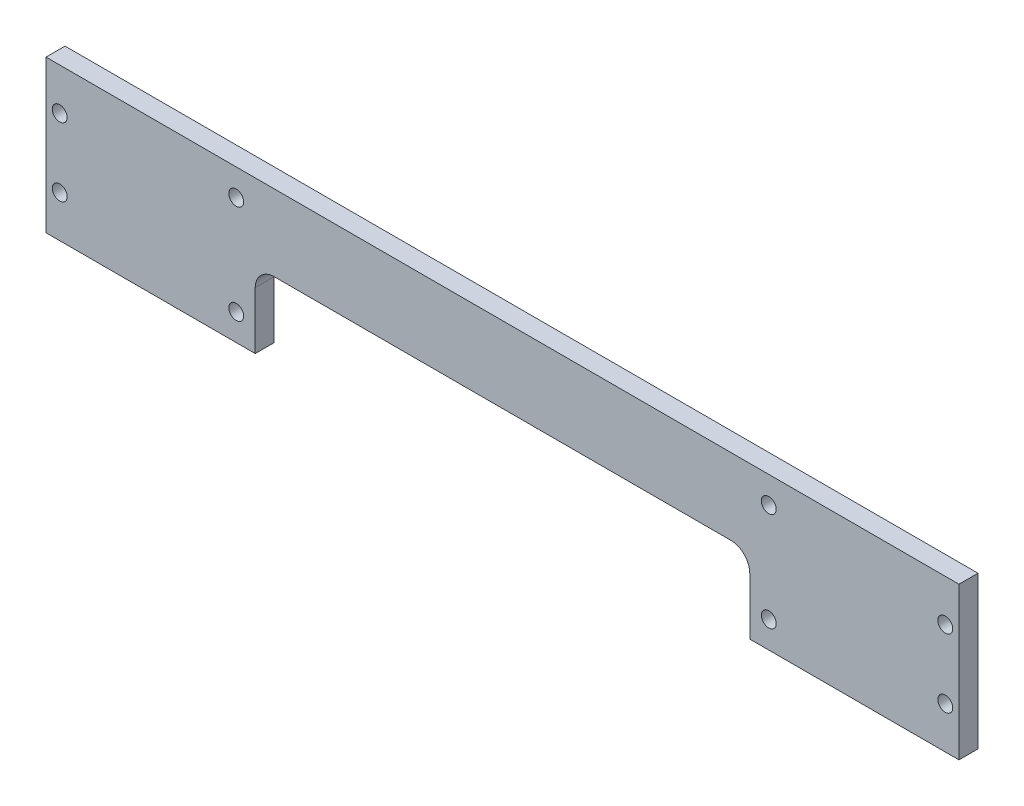
ISO-10303-21;
HEADER;
FILE_DESCRIPTION(('STEP AP214'),'2;1');
FILE_NAME('part.step','',(''),(''),'','','');
FILE_SCHEMA(('AUTOMOTIVE_DESIGN { 1 0 10303 214 1 1 1 1 }'));
ENDSEC;
DATA;
#1=APPLICATION_CONTEXT('core data for automotive mechanical design processes');
#2=APPLICATION_PROTOCOL_DEFINITION('international standard','automotive_design',2000,#1);
#3=PRODUCT_CONTEXT('',#1,'mechanical');
#4=PRODUCT('Part','Part','',(#3));
#5=PRODUCT_RELATED_PRODUCT_CATEGORY('part','',(#4));
#6=PRODUCT_DEFINITION_FORMATION('','',#4);
#7=PRODUCT_DEFINITION_CONTEXT('part definition',#1,'design');
#8=PRODUCT_DEFINITION('design','',#6,#7);
#9=PRODUCT_DEFINITION_SHAPE('','',#8);
#10=(LENGTH_UNIT() NAMED_UNIT(*) SI_UNIT(.MILLI.,.METRE.));
#11=(NAMED_UNIT(*) PLANE_ANGLE_UNIT() SI_UNIT($,.RADIAN.));
#12=(NAMED_UNIT(*) SI_UNIT($,.STERADIAN.) SOLID_ANGLE_UNIT());
#13=UNCERTAINTY_MEASURE_WITH_UNIT(LENGTH_MEASURE(1.E-05),#10,'distance_accuracy_value','');
#14=(GEOMETRIC_REPRESENTATION_CONTEXT(3) GLOBAL_UNCERTAINTY_ASSIGNED_CONTEXT((#13)) GLOBAL_UNIT_ASSIGNED_CONTEXT((#10,
#11,#12)) REPRESENTATION_CONTEXT('',''));
#15=CARTESIAN_POINT('',(0.,0.,0.));
#16=DIRECTION('',(0.,0.,1.));
#17=DIRECTION('',(1.,0.,0.));
#18=AXIS2_PLACEMENT_3D('',#15,#16,#17);
#19=CARTESIAN_POINT('',(-152.4,-25.4,6.35));
#20=DIRECTION('',(0.,1.,0.));
#21=DIRECTION('',(0.,0.,1.));
#22=AXIS2_PLACEMENT_3D('',#19,#20,#21);
#23=PLANE('',#22);
#24=DIRECTION('',(1.,0.,0.));
#25=VECTOR('',#24,1.);
#26=CARTESIAN_POINT('',(-152.4,-25.4,0.));
#27=LINE('',#26,#25);
#28=CARTESIAN_POINT('',(-152.4,-25.4,0.));
#29=VERTEX_POINT('',#28);
#30=CARTESIAN_POINT('',(-82.55,-25.4,0.));
#31=VERTEX_POINT('',#30);
#32=EDGE_CURVE('E125',#29,#31,#27,.T.);
#33=ORIENTED_EDGE('',*,*,#32,.T.);
#34=DIRECTION('',(0.,0.,1.));
#35=VECTOR('',#34,1.);
#36=CARTESIAN_POINT('',(-82.55,-25.4,0.));
#37=LINE('',#36,#35);
#38=CARTESIAN_POINT('',(-82.55,-25.4,6.35));
#39=VERTEX_POINT('',#38);
#40=EDGE_CURVE('E132',#31,#39,#37,.T.);
#41=ORIENTED_EDGE('',*,*,#40,.T.);
#42=DIRECTION('',(1.,0.,0.));
#43=VECTOR('',#42,1.);
#44=CARTESIAN_POINT('',(-152.4,-25.4,6.35));
#45=LINE('',#44,#43);
#46=CARTESIAN_POINT('',(-152.4,-25.4,6.35));
#47=VERTEX_POINT('',#46);
#48=EDGE_CURVE('E163',#47,#39,#45,.T.);
#49=ORIENTED_EDGE('',*,*,#48,.F.);
#50=DIRECTION('',(0.,0.,-1.));
#51=VECTOR('',#50,1.);
#52=CARTESIAN_POINT('',(-152.4,-25.4,6.35));
#53=LINE('',#52,#51);
#54=EDGE_CURVE('E145',#47,#29,#53,.T.);
#55=ORIENTED_EDGE('',*,*,#54,.T.);
#56=EDGE_LOOP('',(#33,#41,#49,#55));
#57=FACE_BOUND('',#56,.T.);
#58=ADVANCED_FACE('F43',(#57),#23,.F.);
#59=CARTESIAN_POINT('',(0.,0.,6.35));
#60=DIRECTION('',(0.,0.,1.));
#61=DIRECTION('',(1.,0.,0.));
#62=AXIS2_PLACEMENT_3D('',#59,#60,#61);
#63=PLANE('',#62);
#64=DIRECTION('',(0.,-1.,0.));
#65=VECTOR('',#64,1.);
#66=CARTESIAN_POINT('',(-82.55,-25.4,6.35));
#67=LINE('',#66,#65);
#68=CARTESIAN_POINT('',(-82.55,-6.35,6.35));
#69=VERTEX_POINT('',#68);
#70=EDGE_CURVE('E135',#69,#39,#67,.T.);
#71=ORIENTED_EDGE('',*,*,#70,.F.);
#72=CARTESIAN_POINT('',(-76.2,-6.35,6.35));
#73=DIRECTION('',(0.,0.,1.));
#74=DIRECTION('',(1.,0.,0.));
#75=AXIS2_PLACEMENT_3D('',#72,#73,#74);
#76=CIRCLE('',#75,6.35);
#77=CARTESIAN_POINT('',(-76.2,0.,6.35));
#78=VERTEX_POINT('',#77);
#79=EDGE_CURVE('E52',#69,#78,#76,.F.);
#80=ORIENTED_EDGE('',*,*,#79,.T.);
#81=DIRECTION('',(-1.,0.,0.));
#82=VECTOR('',#81,1.);
#83=CARTESIAN_POINT('',(-82.55,0.,6.35));
#84=LINE('',#83,#82);
#85=CARTESIAN_POINT('',(76.2,0.,6.35));
#86=VERTEX_POINT('',#85);
#87=EDGE_CURVE('E129',#86,#78,#84,.T.);
#88=ORIENTED_EDGE('',*,*,#87,.F.);
#89=CARTESIAN_POINT('',(76.2,-6.35,6.35));
#90=DIRECTION('',(0.,0.,1.));
#91=DIRECTION('',(1.,0.,0.));
#92=AXIS2_PLACEMENT_3D('',#89,#90,#91);
#93=CIRCLE('',#92,6.35);
#94=CARTESIAN_POINT('',(82.55,-6.35,6.35));
#95=VERTEX_POINT('',#94);
#96=EDGE_CURVE('E187',#86,#95,#93,.F.);
#97=ORIENTED_EDGE('',*,*,#96,.T.);
#98=DIRECTION('',(0.,1.,0.));
#99=VECTOR('',#98,1.);
#100=CARTESIAN_POINT('',(82.55,-25.4,6.35));
#101=LINE('',#100,#99);
#102=CARTESIAN_POINT('',(82.55,-25.4,6.35));
#103=VERTEX_POINT('',#102);
#104=EDGE_CURVE('E203',#103,#95,#101,.T.);
#105=ORIENTED_EDGE('',*,*,#104,.F.);
#106=CARTESIAN_POINT('',(152.4,-25.4,6.35));
#107=VERTEX_POINT('',#106);
#108=EDGE_CURVE('E237',#103,#107,#45,.T.);
#109=ORIENTED_EDGE('',*,*,#108,.T.);
#110=DIRECTION('',(0.,1.,0.));
#111=VECTOR('',#110,1.);
#112=CARTESIAN_POINT('',(152.4,25.4,6.35));
#113=LINE('',#112,#111);
#114=CARTESIAN_POINT('',(152.4,25.4,6.35));
#115=VERTEX_POINT('',#114);
#116=EDGE_CURVE('E147',#107,#115,#113,.T.);
#117=ORIENTED_EDGE('',*,*,#116,.T.);
#118=DIRECTION('',(-1.,0.,0.));
#119=VECTOR('',#118,1.);
#120=CARTESIAN_POINT('',(-152.4,25.4,6.35));
#121=LINE('',#120,#119);
#122=CARTESIAN_POINT('',(-152.4,25.4,6.35));
#123=VERTEX_POINT('',#122);
#124=EDGE_CURVE('E153',#115,#123,#121,.T.);
#125=ORIENTED_EDGE('',*,*,#124,.T.);
#126=DIRECTION('',(0.,-1.,0.));
#127=VECTOR('',#126,1.);
#128=CARTESIAN_POINT('',(-152.4,25.4,6.35));
#129=LINE('',#128,#127);
#130=EDGE_CURVE('E242',#123,#47,#129,.T.);
#131=ORIENTED_EDGE('',*,*,#130,.T.);
#132=ORIENTED_EDGE('',*,*,#48,.T.);
#133=EDGE_LOOP('',(#71,#80,#88,#97,#105,#109,#117,#125,#131,#132));
#134=FACE_BOUND('',#133,.T.);
#135=CARTESIAN_POINT('',(147.828,11.43,6.35));
#136=DIRECTION('',(0.,0.,1.));
#137=DIRECTION('',(1.,0.,0.));
#138=AXIS2_PLACEMENT_3D('',#135,#136,#137);
#139=CIRCLE('',#138,2.4892);
#140=CARTESIAN_POINT('',(150.3172,11.43,6.35));
#141=VERTEX_POINT('',#140);
#142=EDGE_CURVE('E309',#141,#141,#139,.T.);
#143=ORIENTED_EDGE('',*,*,#142,.F.);
#144=EDGE_LOOP('',(#143));
#145=FACE_BOUND('',#144,.T.);
#146=CARTESIAN_POINT('',(-147.828,11.43,6.35));
#147=DIRECTION('',(0.,0.,1.));
#148=DIRECTION('',(1.,0.,0.));
#149=AXIS2_PLACEMENT_3D('',#146,#147,#148);
#150=CIRCLE('',#149,2.4892);
#151=CARTESIAN_POINT('',(-145.3388,11.43,6.35));
#152=VERTEX_POINT('',#151);
#153=EDGE_CURVE('E293',#152,#152,#150,.T.);
#154=ORIENTED_EDGE('',*,*,#153,.F.);
#155=EDGE_LOOP('',(#154));
#156=FACE_BOUND('',#155,.T.);
#157=CARTESIAN_POINT('',(88.9,-16.51,6.35));
#158=DIRECTION('',(0.,0.,1.));
#159=DIRECTION('',(1.,0.,0.));
#160=AXIS2_PLACEMENT_3D('',#157,#158,#159);
#161=CIRCLE('',#160,2.4892);
#162=CARTESIAN_POINT('',(91.3892,-16.51,6.35));
#163=VERTEX_POINT('',#162);
#164=EDGE_CURVE('E277',#163,#163,#161,.T.);
#165=ORIENTED_EDGE('',*,*,#164,.F.);
#166=EDGE_LOOP('',(#165));
#167=FACE_BOUND('',#166,.T.);
#168=CARTESIAN_POINT('',(-88.9,16.51,6.35));
#169=DIRECTION('',(0.,0.,1.));
#170=DIRECTION('',(1.,0.,0.));
#171=AXIS2_PLACEMENT_3D('',#168,#169,#170);
#172=CIRCLE('',#171,2.4892);
#173=CARTESIAN_POINT('',(-86.4108,16.51,6.35));
#174=VERTEX_POINT('',#173);
#175=EDGE_CURVE('E253',#174,#174,#172,.T.);
#176=ORIENTED_EDGE('',*,*,#175,.F.);
#177=EDGE_LOOP('',(#176));
#178=FACE_BOUND('',#177,.T.);
#179=CARTESIAN_POINT('',(-88.9,-16.51,6.35));
#180=DIRECTION('',(0.,0.,1.));
#181=DIRECTION('',(1.,0.,0.));
#182=AXIS2_PLACEMENT_3D('',#179,#180,#181);
#183=CIRCLE('',#182,2.4892);
#184=CARTESIAN_POINT('',(-86.4108,-16.51,6.35));
#185=VERTEX_POINT('',#184);
#186=EDGE_CURVE('E269',#185,#185,#183,.T.);
#187=ORIENTED_EDGE('',*,*,#186,.F.);
#188=EDGE_LOOP('',(#187));
#189=FACE_BOUND('',#188,.T.);
#190=CARTESIAN_POINT('',(88.9,16.51,6.35));
#191=DIRECTION('',(0.,0.,1.));
#192=DIRECTION('',(1.,0.,0.));
#193=AXIS2_PLACEMENT_3D('',#190,#191,#192);
#194=CIRCLE('',#193,2.4892);
#195=CARTESIAN_POINT('',(91.3892,16.51,6.35));
#196=VERTEX_POINT('',#195);
#197=EDGE_CURVE('E285',#196,#196,#194,.T.);
#198=ORIENTED_EDGE('',*,*,#197,.F.);
#199=EDGE_LOOP('',(#198));
#200=FACE_BOUND('',#199,.T.);
#201=CARTESIAN_POINT('',(-147.828,-11.43,6.35));
#202=DIRECTION('',(0.,0.,1.));
#203=DIRECTION('',(1.,0.,0.));
#204=AXIS2_PLACEMENT_3D('',#201,#202,#203);
#205=CIRCLE('',#204,2.4892);
#206=CARTESIAN_POINT('',(-145.3388,-11.43,6.35));
#207=VERTEX_POINT('',#206);
#208=EDGE_CURVE('E301',#207,#207,#205,.T.);
#209=ORIENTED_EDGE('',*,*,#208,.F.);
#210=EDGE_LOOP('',(#209));
#211=FACE_BOUND('',#210,.T.);
#212=CARTESIAN_POINT('',(147.828,-11.43,6.35));
#213=DIRECTION('',(0.,0.,1.));
#214=DIRECTION('',(1.,0.,0.));
#215=AXIS2_PLACEMENT_3D('',#212,#213,#214);
#216=CIRCLE('',#215,2.4892);
#217=CARTESIAN_POINT('',(150.3172,-11.43,6.35));
#218=VERTEX_POINT('',#217);
#219=EDGE_CURVE('E317',#218,#218,#216,.T.);
#220=ORIENTED_EDGE('',*,*,#219,.F.);
#221=EDGE_LOOP('',(#220));
#222=FACE_BOUND('',#221,.T.);
#223=ADVANCED_FACE('F196',(#134,#145,#156,#167,#178,#189,#200,#211,#222),#63,.T.);
#224=CARTESIAN_POINT('',(0.,0.,0.));
#225=DIRECTION('',(0.,0.,1.));
#226=DIRECTION('',(1.,0.,0.));
#227=AXIS2_PLACEMENT_3D('',#224,#225,#226);
#228=PLANE('',#227);
#229=DIRECTION('',(0.,1.,0.));
#230=VECTOR('',#229,1.);
#231=CARTESIAN_POINT('',(82.55,-25.4,0.));
#232=LINE('',#231,#230);
#233=CARTESIAN_POINT('',(82.55,-25.4,0.));
#234=VERTEX_POINT('',#233);
#235=CARTESIAN_POINT('',(82.55,-6.35,0.));
#236=VERTEX_POINT('',#235);
#237=EDGE_CURVE('E128',#234,#236,#232,.T.);
#238=ORIENTED_EDGE('',*,*,#237,.T.);
#239=CARTESIAN_POINT('',(76.2,-6.35,0.));
#240=DIRECTION('',(0.,0.,1.));
#241=DIRECTION('',(1.,0.,0.));
#242=AXIS2_PLACEMENT_3D('',#239,#240,#241);
#243=CIRCLE('',#242,6.35);
#244=CARTESIAN_POINT('',(76.2,0.,0.));
#245=VERTEX_POINT('',#244);
#246=EDGE_CURVE('E190',#236,#245,#243,.T.);
#247=ORIENTED_EDGE('',*,*,#246,.T.);
#248=DIRECTION('',(-1.,0.,0.));
#249=VECTOR('',#248,1.);
#250=CARTESIAN_POINT('',(-82.55,0.,0.));
#251=LINE('',#250,#249);
#252=CARTESIAN_POINT('',(-76.2,0.,0.));
#253=VERTEX_POINT('',#252);
#254=EDGE_CURVE('E141',#245,#253,#251,.T.);
#255=ORIENTED_EDGE('',*,*,#254,.T.);
#256=CARTESIAN_POINT('',(-76.2,-6.35,0.));
#257=DIRECTION('',(0.,0.,1.));
#258=DIRECTION('',(1.,0.,0.));
#259=AXIS2_PLACEMENT_3D('',#256,#257,#258);
#260=CIRCLE('',#259,6.35);
#261=CARTESIAN_POINT('',(-82.55,-6.35,0.));
#262=VERTEX_POINT('',#261);
#263=EDGE_CURVE('E11',#253,#262,#260,.T.);
#264=ORIENTED_EDGE('',*,*,#263,.T.);
#265=DIRECTION('',(0.,-1.,0.));
#266=VECTOR('',#265,1.);
#267=CARTESIAN_POINT('',(-82.55,-25.4,0.));
#268=LINE('',#267,#266);
#269=EDGE_CURVE('E118',#262,#31,#268,.T.);
#270=ORIENTED_EDGE('',*,*,#269,.T.);
#271=ORIENTED_EDGE('',*,*,#32,.F.);
#272=DIRECTION('',(0.,-1.,0.));
#273=VECTOR('',#272,1.);
#274=CARTESIAN_POINT('',(-152.4,25.4,0.));
#275=LINE('',#274,#273);
#276=CARTESIAN_POINT('',(-152.4,25.4,0.));
#277=VERTEX_POINT('',#276);
#278=EDGE_CURVE('E155',#277,#29,#275,.T.);
#279=ORIENTED_EDGE('',*,*,#278,.F.);
#280=DIRECTION('',(-1.,0.,0.));
#281=VECTOR('',#280,1.);
#282=CARTESIAN_POINT('',(-152.4,25.4,0.));
#283=LINE('',#282,#281);
#284=CARTESIAN_POINT('',(152.4,25.4,0.));
#285=VERTEX_POINT('',#284);
#286=EDGE_CURVE('E252',#285,#277,#283,.T.);
#287=ORIENTED_EDGE('',*,*,#286,.F.);
#288=DIRECTION('',(0.,1.,0.));
#289=VECTOR('',#288,1.);
#290=CARTESIAN_POINT('',(152.4,25.4,0.));
#291=LINE('',#290,#289);
#292=CARTESIAN_POINT('',(152.4,-25.4,0.));
#293=VERTEX_POINT('',#292);
#294=EDGE_CURVE('E249',#293,#285,#291,.T.);
#295=ORIENTED_EDGE('',*,*,#294,.F.);
#296=EDGE_CURVE('E148',#234,#293,#27,.T.);
#297=ORIENTED_EDGE('',*,*,#296,.F.);
#298=EDGE_LOOP('',(#238,#247,#255,#264,#270,#271,#279,#287,#295,#297));
#299=FACE_BOUND('',#298,.T.);
#300=CARTESIAN_POINT('',(-88.9,16.51,0.));
#301=DIRECTION('',(0.,0.,1.));
#302=DIRECTION('',(1.,0.,0.));
#303=AXIS2_PLACEMENT_3D('',#300,#301,#302);
#304=CIRCLE('',#303,2.4892);
#305=CARTESIAN_POINT('',(-86.4108,16.51,0.));
#306=VERTEX_POINT('',#305);
#307=EDGE_CURVE('E265',#306,#306,#304,.T.);
#308=ORIENTED_EDGE('',*,*,#307,.T.);
#309=EDGE_LOOP('',(#308));
#310=FACE_BOUND('',#309,.T.);
#311=CARTESIAN_POINT('',(-88.9,-16.51,0.));
#312=DIRECTION('',(0.,0.,1.));
#313=DIRECTION('',(1.,0.,0.));
#314=AXIS2_PLACEMENT_3D('',#311,#312,#313);
#315=CIRCLE('',#314,2.4892);
#316=CARTESIAN_POINT('',(-86.4108,-16.51,0.));
#317=VERTEX_POINT('',#316);
#318=EDGE_CURVE('E273',#317,#317,#315,.T.);
#319=ORIENTED_EDGE('',*,*,#318,.T.);
#320=EDGE_LOOP('',(#319));
#321=FACE_BOUND('',#320,.T.);
#322=CARTESIAN_POINT('',(88.9,-16.51,0.));
#323=DIRECTION('',(0.,0.,1.));
#324=DIRECTION('',(1.,0.,0.));
#325=AXIS2_PLACEMENT_3D('',#322,#323,#324);
#326=CIRCLE('',#325,2.4892);
#327=CARTESIAN_POINT('',(91.3892,-16.51,0.));
#328=VERTEX_POINT('',#327);
#329=EDGE_CURVE('E281',#328,#328,#326,.T.);
#330=ORIENTED_EDGE('',*,*,#329,.T.);
#331=EDGE_LOOP('',(#330));
#332=FACE_BOUND('',#331,.T.);
#333=CARTESIAN_POINT('',(88.9,16.51,0.));
#334=DIRECTION('',(0.,0.,1.));
#335=DIRECTION('',(1.,0.,0.));
#336=AXIS2_PLACEMENT_3D('',#333,#334,#335);
#337=CIRCLE('',#336,2.4892);
#338=CARTESIAN_POINT('',(91.3892,16.51,0.));
#339=VERTEX_POINT('',#338);
#340=EDGE_CURVE('E289',#339,#339,#337,.T.);
#341=ORIENTED_EDGE('',*,*,#340,.T.);
#342=EDGE_LOOP('',(#341));
#343=FACE_BOUND('',#342,.T.);
#344=CARTESIAN_POINT('',(-147.828,11.43,0.));
#345=DIRECTION('',(0.,0.,1.));
#346=DIRECTION('',(1.,0.,0.));
#347=AXIS2_PLACEMENT_3D('',#344,#345,#346);
#348=CIRCLE('',#347,2.4892);
#349=CARTESIAN_POINT('',(-145.3388,11.43,0.));
#350=VERTEX_POINT('',#349);
#351=EDGE_CURVE('E297',#350,#350,#348,.T.);
#352=ORIENTED_EDGE('',*,*,#351,.T.);
#353=EDGE_LOOP('',(#352));
#354=FACE_BOUND('',#353,.T.);
#355=CARTESIAN_POINT('',(-147.828,-11.43,0.));
#356=DIRECTION('',(0.,0.,1.));
#357=DIRECTION('',(1.,0.,0.));
#358=AXIS2_PLACEMENT_3D('',#355,#356,#357);
#359=CIRCLE('',#358,2.4892);
#360=CARTESIAN_POINT('',(-145.3388,-11.43,0.));
#361=VERTEX_POINT('',#360);
#362=EDGE_CURVE('E305',#361,#361,#359,.T.);
#363=ORIENTED_EDGE('',*,*,#362,.T.);
#364=EDGE_LOOP('',(#363));
#365=FACE_BOUND('',#364,.T.);
#366=CARTESIAN_POINT('',(147.828,11.43,0.));
#367=DIRECTION('',(0.,0.,1.));
#368=DIRECTION('',(1.,0.,0.));
#369=AXIS2_PLACEMENT_3D('',#366,#367,#368);
#370=CIRCLE('',#369,2.4892);
#371=CARTESIAN_POINT('',(150.3172,11.43,0.));
#372=VERTEX_POINT('',#371);
#373=EDGE_CURVE('E313',#372,#372,#370,.T.);
#374=ORIENTED_EDGE('',*,*,#373,.T.);
#375=EDGE_LOOP('',(#374));
#376=FACE_BOUND('',#375,.T.);
#377=CARTESIAN_POINT('',(147.828,-11.43,0.));
#378=DIRECTION('',(0.,0.,1.));
#379=DIRECTION('',(1.,0.,0.));
#380=AXIS2_PLACEMENT_3D('',#377,#378,#379);
#381=CIRCLE('',#380,2.4892);
#382=CARTESIAN_POINT('',(150.3172,-11.43,0.));
#383=VERTEX_POINT('',#382);
#384=EDGE_CURVE('E321',#383,#383,#381,.T.);
#385=ORIENTED_EDGE('',*,*,#384,.T.);
#386=EDGE_LOOP('',(#385));
#387=FACE_BOUND('',#386,.T.);
#388=ADVANCED_FACE('F121',(#299,#310,#321,#332,#343,#354,#365,#376,#387),#228,.F.);
#389=CARTESIAN_POINT('',(152.4,25.4,6.35));
#390=DIRECTION('',(-1.,0.,0.));
#391=DIRECTION('',(0.,0.,1.));
#392=AXIS2_PLACEMENT_3D('',#389,#390,#391);
#393=PLANE('',#392);
#394=ORIENTED_EDGE('',*,*,#294,.T.);
#395=DIRECTION('',(0.,0.,-1.));
#396=VECTOR('',#395,1.);
#397=CARTESIAN_POINT('',(152.4,25.4,6.35));
#398=LINE('',#397,#396);
#399=EDGE_CURVE('E170',#115,#285,#398,.T.);
#400=ORIENTED_EDGE('',*,*,#399,.F.);
#401=ORIENTED_EDGE('',*,*,#116,.F.);
#402=DIRECTION('',(0.,0.,-1.));
#403=VECTOR('',#402,1.);
#404=CARTESIAN_POINT('',(152.4,-25.4,6.35));
#405=LINE('',#404,#403);
#406=EDGE_CURVE('E159',#107,#293,#405,.T.);
#407=ORIENTED_EDGE('',*,*,#406,.T.);
#408=EDGE_LOOP('',(#394,#400,#401,#407));
#409=FACE_BOUND('',#408,.T.);
#410=ADVANCED_FACE('F262',(#409),#393,.F.);
#411=CARTESIAN_POINT('',(-152.4,25.4,6.35));
#412=DIRECTION('',(0.,-1.,0.));
#413=DIRECTION('',(0.,0.,-1.));
#414=AXIS2_PLACEMENT_3D('',#411,#412,#413);
#415=PLANE('',#414);
#416=ORIENTED_EDGE('',*,*,#286,.T.);
#417=DIRECTION('',(0.,0.,-1.));
#418=VECTOR('',#417,1.);
#419=CARTESIAN_POINT('',(-152.4,25.4,6.35));
#420=LINE('',#419,#418);
#421=EDGE_CURVE('E166',#123,#277,#420,.T.);
#422=ORIENTED_EDGE('',*,*,#421,.F.);
#423=ORIENTED_EDGE('',*,*,#124,.F.);
#424=ORIENTED_EDGE('',*,*,#399,.T.);
#425=EDGE_LOOP('',(#416,#422,#423,#424));
#426=FACE_BOUND('',#425,.T.);
#427=ADVANCED_FACE('F232',(#426),#415,.F.);
#428=CARTESIAN_POINT('',(-152.4,25.4,6.35));
#429=DIRECTION('',(1.,0.,0.));
#430=DIRECTION('',(0.,0.,-1.));
#431=AXIS2_PLACEMENT_3D('',#428,#429,#430);
#432=PLANE('',#431);
#433=ORIENTED_EDGE('',*,*,#278,.T.);
#434=ORIENTED_EDGE('',*,*,#54,.F.);
#435=ORIENTED_EDGE('',*,*,#130,.F.);
#436=ORIENTED_EDGE('',*,*,#421,.T.);
#437=EDGE_LOOP('',(#433,#434,#435,#436));
#438=FACE_BOUND('',#437,.T.);
#439=ADVANCED_FACE('F223',(#438),#432,.F.);
#440=ORIENTED_EDGE('',*,*,#108,.F.);
#441=DIRECTION('',(0.,0.,1.));
#442=VECTOR('',#441,1.);
#443=CARTESIAN_POINT('',(82.55,-25.4,0.));
#444=LINE('',#443,#442);
#445=EDGE_CURVE('E140',#234,#103,#444,.T.);
#446=ORIENTED_EDGE('',*,*,#445,.F.);
#447=ORIENTED_EDGE('',*,*,#296,.T.);
#448=ORIENTED_EDGE('',*,*,#406,.F.);
#449=EDGE_LOOP('',(#440,#446,#447,#448));
#450=FACE_BOUND('',#449,.T.);
#451=ADVANCED_FACE('F214',(#450),#23,.F.);
#452=CARTESIAN_POINT('',(-88.9,16.51,6.35));
#453=DIRECTION('',(0.,0.,-1.));
#454=DIRECTION('',(-1.,0.,0.));
#455=AXIS2_PLACEMENT_3D('',#452,#453,#454);
#456=CYLINDRICAL_SURFACE('',#455,2.4892);
#457=ORIENTED_EDGE('',*,*,#175,.T.);
#458=EDGE_LOOP('',(#457));
#459=FACE_BOUND('',#458,.T.);
#460=ORIENTED_EDGE('',*,*,#307,.F.);
#461=EDGE_LOOP('',(#460));
#462=FACE_BOUND('',#461,.T.);
#463=ADVANCED_FACE('F222',(#459,#462),#456,.F.);
#464=CARTESIAN_POINT('',(-88.9,-16.51,6.35));
#465=DIRECTION('',(0.,0.,-1.));
#466=DIRECTION('',(-1.,0.,0.));
#467=AXIS2_PLACEMENT_3D('',#464,#465,#466);
#468=CYLINDRICAL_SURFACE('',#467,2.4892);
#469=ORIENTED_EDGE('',*,*,#186,.T.);
#470=EDGE_LOOP('',(#469));
#471=FACE_BOUND('',#470,.T.);
#472=ORIENTED_EDGE('',*,*,#318,.F.);
#473=EDGE_LOOP('',(#472));
#474=FACE_BOUND('',#473,.T.);
#475=ADVANCED_FACE('F229',(#471,#474),#468,.F.);
#476=CARTESIAN_POINT('',(88.9,-16.51,6.35));
#477=DIRECTION('',(0.,0.,-1.));
#478=DIRECTION('',(-1.,0.,0.));
#479=AXIS2_PLACEMENT_3D('',#476,#477,#478);
#480=CYLINDRICAL_SURFACE('',#479,2.4892);
#481=ORIENTED_EDGE('',*,*,#164,.T.);
#482=EDGE_LOOP('',(#481));
#483=FACE_BOUND('',#482,.T.);
#484=ORIENTED_EDGE('',*,*,#329,.F.);
#485=EDGE_LOOP('',(#484));
#486=FACE_BOUND('',#485,.T.);
#487=ADVANCED_FACE('F369',(#483,#486),#480,.F.);
#488=CARTESIAN_POINT('',(88.9,16.51,6.35));
#489=DIRECTION('',(0.,0.,-1.));
#490=DIRECTION('',(-1.,0.,0.));
#491=AXIS2_PLACEMENT_3D('',#488,#489,#490);
#492=CYLINDRICAL_SURFACE('',#491,2.4892);
#493=ORIENTED_EDGE('',*,*,#197,.T.);
#494=EDGE_LOOP('',(#493));
#495=FACE_BOUND('',#494,.T.);
#496=ORIENTED_EDGE('',*,*,#340,.F.);
#497=EDGE_LOOP('',(#496));
#498=FACE_BOUND('',#497,.T.);
#499=ADVANCED_FACE('F365',(#495,#498),#492,.F.);
#500=CARTESIAN_POINT('',(-147.828,11.43,6.35));
#501=DIRECTION('',(0.,0.,-1.));
#502=DIRECTION('',(-1.,0.,0.));
#503=AXIS2_PLACEMENT_3D('',#500,#501,#502);
#504=CYLINDRICAL_SURFACE('',#503,2.4892);
#505=ORIENTED_EDGE('',*,*,#153,.T.);
#506=EDGE_LOOP('',(#505));
#507=FACE_BOUND('',#506,.T.);
#508=ORIENTED_EDGE('',*,*,#351,.F.);
#509=EDGE_LOOP('',(#508));
#510=FACE_BOUND('',#509,.T.);
#511=ADVANCED_FACE('F361',(#507,#510),#504,.F.);
#512=CARTESIAN_POINT('',(-147.828,-11.43,6.35));
#513=DIRECTION('',(0.,0.,-1.));
#514=DIRECTION('',(-1.,0.,0.));
#515=AXIS2_PLACEMENT_3D('',#512,#513,#514);
#516=CYLINDRICAL_SURFACE('',#515,2.4892);
#517=ORIENTED_EDGE('',*,*,#208,.T.);
#518=EDGE_LOOP('',(#517));
#519=FACE_BOUND('',#518,.T.);
#520=ORIENTED_EDGE('',*,*,#362,.F.);
#521=EDGE_LOOP('',(#520));
#522=FACE_BOUND('',#521,.T.);
#523=ADVANCED_FACE('F357',(#519,#522),#516,.F.);
#524=CARTESIAN_POINT('',(147.828,11.43,6.35));
#525=DIRECTION('',(0.,0.,-1.));
#526=DIRECTION('',(-1.,0.,0.));
#527=AXIS2_PLACEMENT_3D('',#524,#525,#526);
#528=CYLINDRICAL_SURFACE('',#527,2.4892);
#529=ORIENTED_EDGE('',*,*,#142,.T.);
#530=EDGE_LOOP('',(#529));
#531=FACE_BOUND('',#530,.T.);
#532=ORIENTED_EDGE('',*,*,#373,.F.);
#533=EDGE_LOOP('',(#532));
#534=FACE_BOUND('',#533,.T.);
#535=ADVANCED_FACE('F353',(#531,#534),#528,.F.);
#536=CARTESIAN_POINT('',(147.828,-11.43,6.35));
#537=DIRECTION('',(0.,0.,-1.));
#538=DIRECTION('',(-1.,0.,0.));
#539=AXIS2_PLACEMENT_3D('',#536,#537,#538);
#540=CYLINDRICAL_SURFACE('',#539,2.4892);
#541=ORIENTED_EDGE('',*,*,#219,.T.);
#542=EDGE_LOOP('',(#541));
#543=FACE_BOUND('',#542,.T.);
#544=ORIENTED_EDGE('',*,*,#384,.F.);
#545=EDGE_LOOP('',(#544));
#546=FACE_BOUND('',#545,.T.);
#547=ADVANCED_FACE('F350',(#543,#546),#540,.F.);
#548=CARTESIAN_POINT('',(-82.55,-25.4,0.));
#549=DIRECTION('',(-1.,0.,0.));
#550=DIRECTION('',(0.,0.,1.));
#551=AXIS2_PLACEMENT_3D('',#548,#549,#550);
#552=PLANE('',#551);
#553=ORIENTED_EDGE('',*,*,#269,.F.);
#554=DIRECTION('',(0.,0.,1.));
#555=VECTOR('',#554,1.);
#556=CARTESIAN_POINT('',(-82.55,-6.35,6.35));
#557=LINE('',#556,#555);
#558=EDGE_CURVE('E184',#262,#69,#557,.T.);
#559=ORIENTED_EDGE('',*,*,#558,.T.);
#560=ORIENTED_EDGE('',*,*,#70,.T.);
#561=ORIENTED_EDGE('',*,*,#40,.F.);
#562=EDGE_LOOP('',(#553,#559,#560,#561));
#563=FACE_BOUND('',#562,.T.);
#564=ADVANCED_FACE('F133',(#563),#552,.F.);
#565=CARTESIAN_POINT('',(-82.55,0.,0.));
#566=DIRECTION('',(0.,1.,0.));
#567=DIRECTION('',(0.,0.,1.));
#568=AXIS2_PLACEMENT_3D('',#565,#566,#567);
#569=PLANE('',#568);
#570=ORIENTED_EDGE('',*,*,#254,.F.);
#571=DIRECTION('',(0.,0.,1.));
#572=VECTOR('',#571,1.);
#573=CARTESIAN_POINT('',(76.2,0.,6.35));
#574=LINE('',#573,#572);
#575=EDGE_CURVE('E177',#245,#86,#574,.T.);
#576=ORIENTED_EDGE('',*,*,#575,.T.);
#577=ORIENTED_EDGE('',*,*,#87,.T.);
#578=DIRECTION('',(0.,0.,1.));
#579=VECTOR('',#578,1.);
#580=CARTESIAN_POINT('',(-76.2,0.,0.));
#581=LINE('',#580,#579);
#582=EDGE_CURVE('E174',#78,#253,#581,.F.);
#583=ORIENTED_EDGE('',*,*,#582,.T.);
#584=EDGE_LOOP('',(#570,#576,#577,#583));
#585=FACE_BOUND('',#584,.T.);
#586=ADVANCED_FACE('F200',(#585),#569,.F.);
#587=CARTESIAN_POINT('',(82.55,-25.4,0.));
#588=DIRECTION('',(1.,0.,0.));
#589=DIRECTION('',(0.,0.,-1.));
#590=AXIS2_PLACEMENT_3D('',#587,#588,#589);
#591=PLANE('',#590);
#592=ORIENTED_EDGE('',*,*,#104,.T.);
#593=DIRECTION('',(0.,0.,1.));
#594=VECTOR('',#593,1.);
#595=CARTESIAN_POINT('',(82.55,-6.35,0.));
#596=LINE('',#595,#594);
#597=EDGE_CURVE('E181',#95,#236,#596,.F.);
#598=ORIENTED_EDGE('',*,*,#597,.T.);
#599=ORIENTED_EDGE('',*,*,#237,.F.);
#600=ORIENTED_EDGE('',*,*,#445,.T.);
#601=EDGE_LOOP('',(#592,#598,#599,#600));
#602=FACE_BOUND('',#601,.T.);
#603=ADVANCED_FACE('F210',(#602),#591,.F.);
#604=CARTESIAN_POINT('',(76.2,-6.35,0.));
#605=DIRECTION('',(0.,0.,-1.));
#606=DIRECTION('',(-1.,0.,0.));
#607=AXIS2_PLACEMENT_3D('',#604,#605,#606);
#608=CYLINDRICAL_SURFACE('',#607,6.35);
#609=ORIENTED_EDGE('',*,*,#246,.F.);
#610=ORIENTED_EDGE('',*,*,#597,.F.);
#611=ORIENTED_EDGE('',*,*,#96,.F.);
#612=ORIENTED_EDGE('',*,*,#575,.F.);
#613=EDGE_LOOP('',(#609,#610,#611,#612));
#614=FACE_BOUND('',#613,.T.);
#615=ADVANCED_FACE('F206',(#614),#608,.F.);
#616=CARTESIAN_POINT('',(-76.2,-6.35,0.));
#617=DIRECTION('',(0.,0.,-1.));
#618=DIRECTION('',(-1.,0.,0.));
#619=AXIS2_PLACEMENT_3D('',#616,#617,#618);
#620=CYLINDRICAL_SURFACE('',#619,6.35);
#621=ORIENTED_EDGE('',*,*,#263,.F.);
#622=ORIENTED_EDGE('',*,*,#582,.F.);
#623=ORIENTED_EDGE('',*,*,#79,.F.);
#624=ORIENTED_EDGE('',*,*,#558,.F.);
#625=EDGE_LOOP('',(#621,#622,#623,#624));
#626=FACE_BOUND('',#625,.T.);
#627=ADVANCED_FACE('F45',(#626),#620,.F.);
#628=CLOSED_SHELL('',(#58,#223,#388,#410,#427,#439,#451,#463,#475,#487,#499,#511,#523,#535,#547,
#564,#586,#603,#615,#627));
#629=MANIFOLD_SOLID_BREP('B2',#628);
#630=ADVANCED_BREP_SHAPE_REPRESENTATION('',(#18,#629),#14);
#631=SHAPE_DEFINITION_REPRESENTATION(#9,#630);
ENDSEC;
END-ISO-10303-21;
